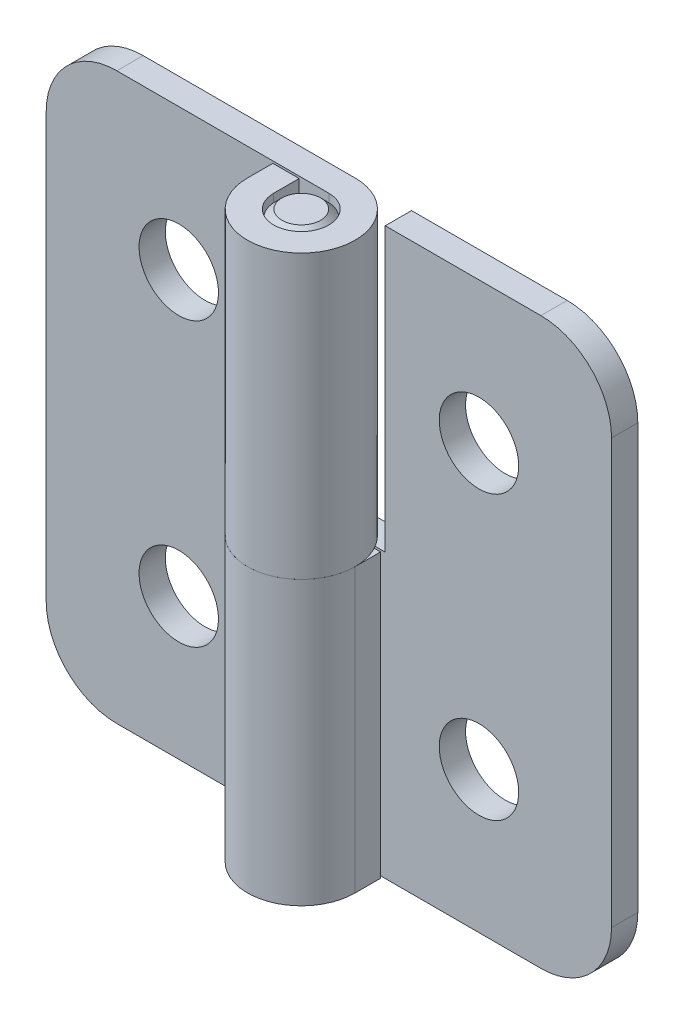
ISO-10303-21;
HEADER;
FILE_DESCRIPTION(('STEP AP214'),'2;1');
FILE_NAME('part.step','',(''),(''),'','','');
FILE_SCHEMA(('AUTOMOTIVE_DESIGN { 1 0 10303 214 1 1 1 1 }'));
ENDSEC;
DATA;
#1=APPLICATION_CONTEXT('core data for automotive mechanical design processes');
#2=APPLICATION_PROTOCOL_DEFINITION('international standard','automotive_design',2000,#1);
#3=PRODUCT_CONTEXT('',#1,'mechanical');
#4=PRODUCT('Part','Part','',(#3));
#5=PRODUCT_RELATED_PRODUCT_CATEGORY('part','',(#4));
#6=PRODUCT_DEFINITION_FORMATION('','',#4);
#7=PRODUCT_DEFINITION_CONTEXT('part definition',#1,'design');
#8=PRODUCT_DEFINITION('design','',#6,#7);
#9=PRODUCT_DEFINITION_SHAPE('','',#8);
#10=(LENGTH_UNIT() NAMED_UNIT(*) SI_UNIT(.MILLI.,.METRE.));
#11=(NAMED_UNIT(*) PLANE_ANGLE_UNIT() SI_UNIT($,.RADIAN.));
#12=(NAMED_UNIT(*) SI_UNIT($,.STERADIAN.) SOLID_ANGLE_UNIT());
#13=UNCERTAINTY_MEASURE_WITH_UNIT(LENGTH_MEASURE(1.E-05),#10,'distance_accuracy_value','');
#14=(GEOMETRIC_REPRESENTATION_CONTEXT(3) GLOBAL_UNCERTAINTY_ASSIGNED_CONTEXT((#13)) GLOBAL_UNIT_ASSIGNED_CONTEXT((#10,
#11,#12)) REPRESENTATION_CONTEXT('',''));
#15=CARTESIAN_POINT('',(0.,0.,0.));
#16=DIRECTION('',(0.,0.,1.));
#17=DIRECTION('',(1.,0.,0.));
#18=AXIS2_PLACEMENT_3D('',#15,#16,#17);
#19=CARTESIAN_POINT('',(4.8387,-25.4,2.55270000000001));
#20=DIRECTION('',(1.,0.,0.));
#21=DIRECTION('',(0.,0.,1.));
#22=AXIS2_PLACEMENT_3D('',#19,#20,#21);
#23=PLANE('',#22);
#24=DIRECTION('',(0.,0.,1.));
#25=VECTOR('',#24,1.);
#26=CARTESIAN_POINT('',(4.8387,0.,10.9397930174127));
#27=LINE('',#26,#25);
#28=CARTESIAN_POINT('',(4.8387,0.,2.55270000000001));
#29=VERTEX_POINT('',#28);
#30=CARTESIAN_POINT('',(4.8387,0.,4.8387));
#31=VERTEX_POINT('',#30);
#32=EDGE_CURVE('P0_E274',#29,#31,#27,.T.);
#33=ORIENTED_EDGE('',*,*,#32,.T.);
#34=DIRECTION('',(0.,1.,0.));
#35=VECTOR('',#34,1.);
#36=CARTESIAN_POINT('',(4.8387,-25.4,4.8387));
#37=LINE('',#36,#35);
#38=CARTESIAN_POINT('',(4.83870000000001,-25.4,4.8387));
#39=VERTEX_POINT('',#38);
#40=EDGE_CURVE('P0_E250',#39,#31,#37,.T.);
#41=ORIENTED_EDGE('',*,*,#40,.F.);
#42=DIRECTION('',(0.,0.,-1.));
#43=VECTOR('',#42,1.);
#44=CARTESIAN_POINT('',(4.83870000000002,-25.4,3.43572275257362));
#45=LINE('',#44,#43);
#46=CARTESIAN_POINT('',(4.83870000000001,-25.4,2.55270000000001));
#47=VERTEX_POINT('',#46);
#48=EDGE_CURVE('P0_E220',#47,#39,#45,.F.);
#49=ORIENTED_EDGE('',*,*,#48,.F.);
#50=DIRECTION('',(0.,1.,0.));
#51=VECTOR('',#50,1.);
#52=CARTESIAN_POINT('',(4.8387,-25.4,2.55270000000001));
#53=LINE('',#52,#51);
#54=EDGE_CURVE('P0_E257',#29,#47,#53,.F.);
#55=ORIENTED_EDGE('',*,*,#54,.F.);
#56=EDGE_LOOP('',(#33,#41,#49,#55));
#57=FACE_BOUND('',#56,.T.);
#58=ADVANCED_FACE('P0_F46',(#57),#23,.T.);
#59=CARTESIAN_POINT('',(0.,-25.4,4.8387));
#60=DIRECTION('',(0.,1.,0.));
#61=DIRECTION('',(-1.,0.,0.));
#62=AXIS2_PLACEMENT_3D('',#59,#60,#61);
#63=CYLINDRICAL_SURFACE('',#62,4.8387);
#64=CARTESIAN_POINT('',(0.,0.,4.8387));
#65=DIRECTION('',(0.,1.,0.));
#66=DIRECTION('',(-1.,0.,0.));
#67=AXIS2_PLACEMENT_3D('',#64,#65,#66);
#68=CIRCLE('',#67,4.8387);
#69=CARTESIAN_POINT('',(0.,0.,0.));
#70=VERTEX_POINT('',#69);
#71=EDGE_CURVE('P0_E282',#31,#70,#68,.F.);
#72=ORIENTED_EDGE('',*,*,#71,.T.);
#73=DIRECTION('',(0.,1.,0.));
#74=VECTOR('',#73,1.);
#75=CARTESIAN_POINT('',(0.,-25.4,0.));
#76=LINE('',#75,#74);
#77=CARTESIAN_POINT('',(0.,-25.4,0.));
#78=VERTEX_POINT('',#77);
#79=EDGE_CURVE('P0_E260',#78,#70,#76,.T.);
#80=ORIENTED_EDGE('',*,*,#79,.F.);
#81=CARTESIAN_POINT('',(0.,-25.4,4.8387));
#82=DIRECTION('',(0.,1.,0.));
#83=DIRECTION('',(-1.,0.,0.));
#84=AXIS2_PLACEMENT_3D('',#81,#82,#83);
#85=CIRCLE('',#84,4.8387);
#86=EDGE_CURVE('P0_E214',#39,#78,#85,.F.);
#87=ORIENTED_EDGE('',*,*,#86,.F.);
#88=ORIENTED_EDGE('',*,*,#40,.T.);
#89=EDGE_LOOP('',(#72,#80,#87,#88));
#90=FACE_BOUND('',#89,.T.);
#91=ADVANCED_FACE('P0_F354',(#90),#63,.T.);
#92=CARTESIAN_POINT('',(2.4765,-25.4,4.8387));
#93=DIRECTION('',(-1.,0.,0.));
#94=DIRECTION('',(0.,-1.,0.));
#95=AXIS2_PLACEMENT_3D('',#92,#93,#94);
#96=PLANE('',#95);
#97=DIRECTION('',(0.,0.,1.));
#98=VECTOR('',#97,1.);
#99=CARTESIAN_POINT('',(2.47650000000001,0.,10.9397930174127));
#100=LINE('',#99,#98);
#101=CARTESIAN_POINT('',(2.47650000000001,0.,4.8387));
#102=VERTEX_POINT('',#101);
#103=CARTESIAN_POINT('',(2.47650000000002,0.,2.55270000000001));
#104=VERTEX_POINT('',#103);
#105=EDGE_CURVE('P0_E171',#102,#104,#100,.F.);
#106=ORIENTED_EDGE('',*,*,#105,.T.);
#107=DIRECTION('',(0.,1.,0.));
#108=VECTOR('',#107,1.);
#109=CARTESIAN_POINT('',(2.47650000000004,-25.4,2.55270000000001));
#110=LINE('',#109,#108);
#111=CARTESIAN_POINT('',(2.47650000000002,-25.4,2.55270000000001));
#112=VERTEX_POINT('',#111);
#113=EDGE_CURVE('P0_E249',#112,#104,#110,.T.);
#114=ORIENTED_EDGE('',*,*,#113,.F.);
#115=DIRECTION('',(0.,0.,-1.));
#116=VECTOR('',#115,1.);
#117=CARTESIAN_POINT('',(2.47650000000001,-25.4,3.43572275257362));
#118=LINE('',#117,#116);
#119=CARTESIAN_POINT('',(2.47650000000001,-25.4,4.8387));
#120=VERTEX_POINT('',#119);
#121=EDGE_CURVE('P0_E218',#120,#112,#118,.T.);
#122=ORIENTED_EDGE('',*,*,#121,.F.);
#123=DIRECTION('',(0.,-1.,0.));
#124=VECTOR('',#123,1.);
#125=CARTESIAN_POINT('',(2.4765,-25.4,4.8387));
#126=LINE('',#125,#124);
#127=EDGE_CURVE('P0_E246',#120,#102,#126,.F.);
#128=ORIENTED_EDGE('',*,*,#127,.T.);
#129=EDGE_LOOP('',(#106,#114,#122,#128));
#130=FACE_BOUND('',#129,.T.);
#131=ADVANCED_FACE('P0_F344',(#130),#96,.T.);
#132=CARTESIAN_POINT('',(2.47650000000005,-25.4,2.55270000000001));
#133=DIRECTION('',(0.,0.,-1.));
#134=DIRECTION('',(0.,1.,0.));
#135=AXIS2_PLACEMENT_3D('',#132,#133,#134);
#136=PLANE('',#135);
#137=DIRECTION('',(1.,0.,0.));
#138=VECTOR('',#137,1.);
#139=CARTESIAN_POINT('',(-4.8387,0.,2.55270000000001));
#140=LINE('',#139,#138);
#141=EDGE_CURVE('P0_E271',#104,#29,#140,.T.);
#142=ORIENTED_EDGE('',*,*,#141,.T.);
#143=ORIENTED_EDGE('',*,*,#54,.T.);
#144=DIRECTION('',(1.,0.,0.));
#145=VECTOR('',#144,1.);
#146=CARTESIAN_POINT('',(6.02577724742644,-25.4,2.55270000000001));
#147=LINE('',#146,#145);
#148=EDGE_CURVE('P0_E242',#112,#47,#147,.T.);
#149=ORIENTED_EDGE('',*,*,#148,.F.);
#150=ORIENTED_EDGE('',*,*,#113,.T.);
#151=EDGE_LOOP('',(#142,#143,#149,#150));
#152=FACE_BOUND('',#151,.T.);
#153=ADVANCED_FACE('P0_F303',(#152),#136,.T.);
#154=CARTESIAN_POINT('',(0.,-25.4,0.));
#155=DIRECTION('',(0.,0.,-1.));
#156=DIRECTION('',(0.,1.,0.));
#157=AXIS2_PLACEMENT_3D('',#154,#155,#156);
#158=PLANE('',#157);
#159=DIRECTION('',(0.,-1.,0.));
#160=VECTOR('',#159,1.);
#161=CARTESIAN_POINT('',(25.4,-25.4,0.));
#162=LINE('',#161,#160);
#163=CARTESIAN_POINT('',(25.4,-19.05,0.));
#164=VERTEX_POINT('',#163);
#165=CARTESIAN_POINT('',(25.4,19.05,0.));
#166=VERTEX_POINT('',#165);
#167=EDGE_CURVE('P0_E211',#164,#166,#162,.F.);
#168=ORIENTED_EDGE('',*,*,#167,.F.);
#169=CARTESIAN_POINT('',(19.05,-19.05,0.));
#170=DIRECTION('',(0.,0.,-1.));
#171=DIRECTION('',(-1.,0.,0.));
#172=AXIS2_PLACEMENT_3D('',#169,#170,#171);
#173=CIRCLE('',#172,6.35);
#174=CARTESIAN_POINT('',(19.05,-25.4,0.));
#175=VERTEX_POINT('',#174);
#176=EDGE_CURVE('P0_E198',#164,#175,#173,.T.);
#177=ORIENTED_EDGE('',*,*,#176,.T.);
#178=DIRECTION('',(1.,0.,0.));
#179=VECTOR('',#178,1.);
#180=CARTESIAN_POINT('',(6.02577724742644,-25.4,0.));
#181=LINE('',#180,#179);
#182=EDGE_CURVE('P0_E209',#78,#175,#181,.T.);
#183=ORIENTED_EDGE('',*,*,#182,.F.);
#184=ORIENTED_EDGE('',*,*,#79,.T.);
#185=DIRECTION('',(1.,0.,0.));
#186=VECTOR('',#185,1.);
#187=CARTESIAN_POINT('',(-4.8387,0.,0.));
#188=LINE('',#187,#186);
#189=CARTESIAN_POINT('',(5.0673,0.,0.));
#190=VERTEX_POINT('',#189);
#191=EDGE_CURVE('P0_E147',#70,#190,#188,.T.);
#192=ORIENTED_EDGE('',*,*,#191,.T.);
#193=DIRECTION('',(0.,1.,0.));
#194=VECTOR('',#193,1.);
#195=CARTESIAN_POINT('',(5.0673,25.4,0.));
#196=LINE('',#195,#194);
#197=CARTESIAN_POINT('',(5.0673,25.4,0.));
#198=VERTEX_POINT('',#197);
#199=EDGE_CURVE('P0_E143',#190,#198,#196,.T.);
#200=ORIENTED_EDGE('',*,*,#199,.T.);
#201=DIRECTION('',(1.,0.,0.));
#202=VECTOR('',#201,1.);
#203=CARTESIAN_POINT('',(25.4,25.4,0.));
#204=LINE('',#203,#202);
#205=CARTESIAN_POINT('',(19.05,25.4,0.));
#206=VERTEX_POINT('',#205);
#207=EDGE_CURVE('P0_E176',#198,#206,#204,.T.);
#208=ORIENTED_EDGE('',*,*,#207,.T.);
#209=CARTESIAN_POINT('',(19.05,19.05,0.));
#210=DIRECTION('',(0.,0.,-1.));
#211=DIRECTION('',(-1.,0.,0.));
#212=AXIS2_PLACEMENT_3D('',#209,#210,#211);
#213=CIRCLE('',#212,6.35);
#214=EDGE_CURVE('P0_E199',#206,#166,#213,.T.);
#215=ORIENTED_EDGE('',*,*,#214,.T.);
#216=EDGE_LOOP('',(#168,#177,#183,#184,#192,#200,#208,#215));
#217=FACE_BOUND('',#216,.T.);
#218=CARTESIAN_POINT('',(13.4874,12.7,0.));
#219=DIRECTION('',(0.,0.,1.));
#220=DIRECTION('',(0.,-1.,0.));
#221=AXIS2_PLACEMENT_3D('',#218,#219,#220);
#222=CIRCLE('',#221,3.5687);
#223=CARTESIAN_POINT('',(13.4874,9.13129999999999,0.));
#224=VERTEX_POINT('',#223);
#225=EDGE_CURVE('P0_E283',#224,#224,#222,.T.);
#226=ORIENTED_EDGE('',*,*,#225,.T.);
#227=EDGE_LOOP('',(#226));
#228=FACE_BOUND('',#227,.T.);
#229=CARTESIAN_POINT('',(13.4874,-12.7,0.));
#230=DIRECTION('',(0.,0.,1.));
#231=DIRECTION('',(0.,-1.,0.));
#232=AXIS2_PLACEMENT_3D('',#229,#230,#231);
#233=CIRCLE('',#232,3.5687);
#234=CARTESIAN_POINT('',(13.4874,-16.2687,0.));
#235=VERTEX_POINT('',#234);
#236=EDGE_CURVE('P0_E238',#235,#235,#233,.T.);
#237=ORIENTED_EDGE('',*,*,#236,.T.);
#238=EDGE_LOOP('',(#237));
#239=FACE_BOUND('',#238,.T.);
#240=ADVANCED_FACE('P0_F206',(#217,#228,#239),#158,.T.);
#241=CARTESIAN_POINT('',(13.4874,-12.7,-3.9066238945256));
#242=DIRECTION('',(0.,0.,1.));
#243=DIRECTION('',(0.,-1.,0.));
#244=AXIS2_PLACEMENT_3D('',#241,#242,#243);
#245=CYLINDRICAL_SURFACE('',#244,3.5687);
#246=CARTESIAN_POINT('',(13.4874,-12.7,2.3622));
#247=DIRECTION('',(0.,0.,1.));
#248=DIRECTION('',(0.,-1.,0.));
#249=AXIS2_PLACEMENT_3D('',#246,#247,#248);
#250=CIRCLE('',#249,3.5687);
#251=CARTESIAN_POINT('',(13.4874,-16.2687,2.3622));
#252=VERTEX_POINT('',#251);
#253=EDGE_CURVE('P0_E241',#252,#252,#250,.F.);
#254=ORIENTED_EDGE('',*,*,#253,.F.);
#255=EDGE_LOOP('',(#254));
#256=FACE_BOUND('',#255,.T.);
#257=ORIENTED_EDGE('',*,*,#236,.F.);
#258=EDGE_LOOP('',(#257));
#259=FACE_BOUND('',#258,.T.);
#260=ADVANCED_FACE('P0_F291',(#256,#259),#245,.F.);
#261=CARTESIAN_POINT('',(13.4874,12.7,-3.9066238945256));
#262=DIRECTION('',(0.,0.,1.));
#263=DIRECTION('',(0.,-1.,0.));
#264=AXIS2_PLACEMENT_3D('',#261,#262,#263);
#265=CYLINDRICAL_SURFACE('',#264,3.5687);
#266=CARTESIAN_POINT('',(13.4874,12.7,2.3622));
#267=DIRECTION('',(0.,0.,1.));
#268=DIRECTION('',(0.,-1.,0.));
#269=AXIS2_PLACEMENT_3D('',#266,#267,#268);
#270=CIRCLE('',#269,3.5687);
#271=CARTESIAN_POINT('',(13.4874,9.13129999999999,2.3622));
#272=VERTEX_POINT('',#271);
#273=EDGE_CURVE('P0_E162',#272,#272,#270,.F.);
#274=ORIENTED_EDGE('',*,*,#273,.F.);
#275=EDGE_LOOP('',(#274));
#276=FACE_BOUND('',#275,.T.);
#277=ORIENTED_EDGE('',*,*,#225,.F.);
#278=EDGE_LOOP('',(#277));
#279=FACE_BOUND('',#278,.T.);
#280=ADVANCED_FACE('P0_F293',(#276,#279),#265,.F.);
#281=CARTESIAN_POINT('',(25.4,25.4,2.3622));
#282=DIRECTION('',(0.,-1.,0.));
#283=DIRECTION('',(0.,0.,-1.));
#284=AXIS2_PLACEMENT_3D('',#281,#282,#283);
#285=PLANE('',#284);
#286=DIRECTION('',(1.,0.,0.));
#287=VECTOR('',#286,1.);
#288=CARTESIAN_POINT('',(25.4,25.4,2.3622));
#289=LINE('',#288,#287);
#290=CARTESIAN_POINT('',(19.05,25.4,2.3622));
#291=VERTEX_POINT('',#290);
#292=CARTESIAN_POINT('',(5.0673,25.4,2.3622));
#293=VERTEX_POINT('',#292);
#294=EDGE_CURVE('P0_E159',#291,#293,#289,.F.);
#295=ORIENTED_EDGE('',*,*,#294,.F.);
#296=DIRECTION('',(0.,0.,1.));
#297=VECTOR('',#296,1.);
#298=CARTESIAN_POINT('',(19.05,25.4,0.));
#299=LINE('',#298,#297);
#300=EDGE_CURVE('P0_E12',#291,#206,#299,.F.);
#301=ORIENTED_EDGE('',*,*,#300,.T.);
#302=ORIENTED_EDGE('',*,*,#207,.F.);
#303=DIRECTION('',(0.,0.,1.));
#304=VECTOR('',#303,1.);
#305=CARTESIAN_POINT('',(5.0673,25.4,10.9397930174127));
#306=LINE('',#305,#304);
#307=EDGE_CURVE('P0_E169',#198,#293,#306,.T.);
#308=ORIENTED_EDGE('',*,*,#307,.T.);
#309=EDGE_LOOP('',(#295,#301,#302,#308));
#310=FACE_BOUND('',#309,.T.);
#311=ADVANCED_FACE('P0_F300',(#310),#285,.F.);
#312=CARTESIAN_POINT('',(5.0673,25.4,10.9397930174127));
#313=DIRECTION('',(1.,0.,0.));
#314=DIRECTION('',(0.,1.,0.));
#315=AXIS2_PLACEMENT_3D('',#312,#313,#314);
#316=PLANE('',#315);
#317=ORIENTED_EDGE('',*,*,#199,.F.);
#318=DIRECTION('',(0.,0.,1.));
#319=VECTOR('',#318,1.);
#320=CARTESIAN_POINT('',(5.0673,0.,10.9397930174127));
#321=LINE('',#320,#319);
#322=CARTESIAN_POINT('',(5.0673,0.,2.3622));
#323=VERTEX_POINT('',#322);
#324=EDGE_CURVE('P0_E137',#190,#323,#321,.T.);
#325=ORIENTED_EDGE('',*,*,#324,.T.);
#326=DIRECTION('',(0.,-1.,0.));
#327=VECTOR('',#326,1.);
#328=CARTESIAN_POINT('',(5.0673,-25.4,2.3622));
#329=LINE('',#328,#327);
#330=EDGE_CURVE('P0_E142',#293,#323,#329,.T.);
#331=ORIENTED_EDGE('',*,*,#330,.F.);
#332=ORIENTED_EDGE('',*,*,#307,.F.);
#333=EDGE_LOOP('',(#317,#325,#331,#332));
#334=FACE_BOUND('',#333,.T.);
#335=ADVANCED_FACE('P0_F139',(#334),#316,.F.);
#336=CARTESIAN_POINT('',(-4.8387,0.,10.9397930174127));
#337=DIRECTION('',(0.,-1.,0.));
#338=DIRECTION('',(1.,0.,0.));
#339=AXIS2_PLACEMENT_3D('',#336,#337,#338);
#340=PLANE('',#339);
#341=ORIENTED_EDGE('',*,*,#191,.F.);
#342=ORIENTED_EDGE('',*,*,#71,.F.);
#343=ORIENTED_EDGE('',*,*,#32,.F.);
#344=ORIENTED_EDGE('',*,*,#141,.F.);
#345=ORIENTED_EDGE('',*,*,#105,.F.);
#346=CARTESIAN_POINT('',(0.,0.,4.8387));
#347=DIRECTION('',(0.,1.,0.));
#348=DIRECTION('',(-1.,0.,0.));
#349=AXIS2_PLACEMENT_3D('',#346,#347,#348);
#350=CIRCLE('',#349,2.4765);
#351=CARTESIAN_POINT('',(0.,0.,2.3622));
#352=VERTEX_POINT('',#351);
#353=EDGE_CURVE('P0_E146',#102,#352,#350,.F.);
#354=ORIENTED_EDGE('',*,*,#353,.T.);
#355=DIRECTION('',(1.,0.,0.));
#356=VECTOR('',#355,1.);
#357=CARTESIAN_POINT('',(25.4,0.,2.3622));
#358=LINE('',#357,#356);
#359=EDGE_CURVE('P0_E150',#323,#352,#358,.F.);
#360=ORIENTED_EDGE('',*,*,#359,.F.);
#361=ORIENTED_EDGE('',*,*,#324,.F.);
#362=EDGE_LOOP('',(#341,#342,#343,#344,#345,#354,#360,#361));
#363=FACE_BOUND('',#362,.T.);
#364=ADVANCED_FACE('P0_F151',(#363),#340,.F.);
#365=CARTESIAN_POINT('',(0.,-25.4,4.8387));
#366=DIRECTION('',(0.,1.,0.));
#367=DIRECTION('',(-1.,0.,0.));
#368=AXIS2_PLACEMENT_3D('',#365,#366,#367);
#369=CYLINDRICAL_SURFACE('',#368,2.4765);
#370=CARTESIAN_POINT('',(0.,-25.4,4.8387));
#371=DIRECTION('',(0.,1.,0.));
#372=DIRECTION('',(-1.,0.,0.));
#373=AXIS2_PLACEMENT_3D('',#370,#371,#372);
#374=CIRCLE('',#373,2.4765);
#375=CARTESIAN_POINT('',(0.,-25.4,2.3622));
#376=VERTEX_POINT('',#375);
#377=EDGE_CURVE('P0_E215',#376,#120,#374,.T.);
#378=ORIENTED_EDGE('',*,*,#377,.F.);
#379=DIRECTION('',(0.,-1.,0.));
#380=VECTOR('',#379,1.);
#381=CARTESIAN_POINT('',(0.,-25.4,2.3622));
#382=LINE('',#381,#380);
#383=EDGE_CURVE('P0_E155',#352,#376,#382,.T.);
#384=ORIENTED_EDGE('',*,*,#383,.F.);
#385=ORIENTED_EDGE('',*,*,#353,.F.);
#386=ORIENTED_EDGE('',*,*,#127,.F.);
#387=EDGE_LOOP('',(#378,#384,#385,#386));
#388=FACE_BOUND('',#387,.T.);
#389=ADVANCED_FACE('P0_F316',(#388),#369,.F.);
#390=CARTESIAN_POINT('',(6.02577724742644,-25.4,3.43572275257362));
#391=DIRECTION('',(0.,-1.,0.));
#392=DIRECTION('',(0.,0.,-1.));
#393=AXIS2_PLACEMENT_3D('',#390,#391,#392);
#394=PLANE('',#393);
#395=ORIENTED_EDGE('',*,*,#182,.T.);
#396=DIRECTION('',(0.,0.,-1.));
#397=VECTOR('',#396,1.);
#398=CARTESIAN_POINT('',(19.05,-25.4,3.43572275257362));
#399=LINE('',#398,#397);
#400=CARTESIAN_POINT('',(19.05,-25.4,2.3622));
#401=VERTEX_POINT('',#400);
#402=EDGE_CURVE('P0_E69',#175,#401,#399,.F.);
#403=ORIENTED_EDGE('',*,*,#402,.T.);
#404=DIRECTION('',(1.,0.,0.));
#405=VECTOR('',#404,1.);
#406=CARTESIAN_POINT('',(25.4,-25.4,2.3622));
#407=LINE('',#406,#405);
#408=EDGE_CURVE('P0_E184',#376,#401,#407,.T.);
#409=ORIENTED_EDGE('',*,*,#408,.F.);
#410=ORIENTED_EDGE('',*,*,#377,.T.);
#411=ORIENTED_EDGE('',*,*,#121,.T.);
#412=ORIENTED_EDGE('',*,*,#148,.T.);
#413=ORIENTED_EDGE('',*,*,#48,.T.);
#414=ORIENTED_EDGE('',*,*,#86,.T.);
#415=EDGE_LOOP('',(#395,#403,#409,#410,#411,#412,#413,#414));
#416=FACE_BOUND('',#415,.T.);
#417=ADVANCED_FACE('P0_F212',(#416),#394,.T.);
#418=CARTESIAN_POINT('',(25.4,-25.4,0.));
#419=DIRECTION('',(1.,0.,0.));
#420=DIRECTION('',(0.,0.,1.));
#421=AXIS2_PLACEMENT_3D('',#418,#419,#420);
#422=PLANE('',#421);
#423=DIRECTION('',(0.,-1.,0.));
#424=VECTOR('',#423,1.);
#425=CARTESIAN_POINT('',(25.4,-25.4,2.3622));
#426=LINE('',#425,#424);
#427=CARTESIAN_POINT('',(25.4,-19.05,2.3622));
#428=VERTEX_POINT('',#427);
#429=CARTESIAN_POINT('',(25.4,19.05,2.3622));
#430=VERTEX_POINT('',#429);
#431=EDGE_CURVE('P0_E183',#428,#430,#426,.F.);
#432=ORIENTED_EDGE('',*,*,#431,.F.);
#433=DIRECTION('',(0.,0.,-1.));
#434=VECTOR('',#433,1.);
#435=CARTESIAN_POINT('',(25.4,-19.05,0.));
#436=LINE('',#435,#434);
#437=EDGE_CURVE('P0_E192',#428,#164,#436,.T.);
#438=ORIENTED_EDGE('',*,*,#437,.T.);
#439=ORIENTED_EDGE('',*,*,#167,.T.);
#440=DIRECTION('',(0.,0.,1.));
#441=VECTOR('',#440,1.);
#442=CARTESIAN_POINT('',(25.4,19.05,2.3622));
#443=LINE('',#442,#441);
#444=EDGE_CURVE('P0_E195',#166,#430,#443,.T.);
#445=ORIENTED_EDGE('',*,*,#444,.T.);
#446=EDGE_LOOP('',(#432,#438,#439,#445));
#447=FACE_BOUND('',#446,.T.);
#448=ADVANCED_FACE('P0_F190',(#447),#422,.T.);
#449=CARTESIAN_POINT('',(25.4,-25.4,2.3622));
#450=DIRECTION('',(0.,0.,1.));
#451=DIRECTION('',(0.,-1.,0.));
#452=AXIS2_PLACEMENT_3D('',#449,#450,#451);
#453=PLANE('',#452);
#454=ORIENTED_EDGE('',*,*,#408,.T.);
#455=CARTESIAN_POINT('',(19.05,-19.05,2.3622));
#456=DIRECTION('',(0.,0.,1.));
#457=DIRECTION('',(1.,0.,0.));
#458=AXIS2_PLACEMENT_3D('',#455,#456,#457);
#459=CIRCLE('',#458,6.35);
#460=EDGE_CURVE('P0_E54',#401,#428,#459,.T.);
#461=ORIENTED_EDGE('',*,*,#460,.T.);
#462=ORIENTED_EDGE('',*,*,#431,.T.);
#463=CARTESIAN_POINT('',(19.05,19.05,2.3622));
#464=DIRECTION('',(0.,0.,1.));
#465=DIRECTION('',(1.,0.,0.));
#466=AXIS2_PLACEMENT_3D('',#463,#464,#465);
#467=CIRCLE('',#466,6.35);
#468=EDGE_CURVE('P0_E61',#430,#291,#467,.T.);
#469=ORIENTED_EDGE('',*,*,#468,.T.);
#470=ORIENTED_EDGE('',*,*,#294,.T.);
#471=ORIENTED_EDGE('',*,*,#330,.T.);
#472=ORIENTED_EDGE('',*,*,#359,.T.);
#473=ORIENTED_EDGE('',*,*,#383,.T.);
#474=EDGE_LOOP('',(#454,#461,#462,#469,#470,#471,#472,#473));
#475=FACE_BOUND('',#474,.T.);
#476=ORIENTED_EDGE('',*,*,#273,.T.);
#477=EDGE_LOOP('',(#476));
#478=FACE_BOUND('',#477,.T.);
#479=ORIENTED_EDGE('',*,*,#253,.T.);
#480=EDGE_LOOP('',(#479));
#481=FACE_BOUND('',#480,.T.);
#482=ADVANCED_FACE('P0_F157',(#475,#478,#481),#453,.T.);
#483=CARTESIAN_POINT('',(19.05,-19.05,0.));
#484=DIRECTION('',(0.,0.,-1.));
#485=DIRECTION('',(-1.,0.,0.));
#486=AXIS2_PLACEMENT_3D('',#483,#484,#485);
#487=CYLINDRICAL_SURFACE('',#486,6.35);
#488=ORIENTED_EDGE('',*,*,#460,.F.);
#489=ORIENTED_EDGE('',*,*,#402,.F.);
#490=ORIENTED_EDGE('',*,*,#176,.F.);
#491=ORIENTED_EDGE('',*,*,#437,.F.);
#492=EDGE_LOOP('',(#488,#489,#490,#491));
#493=FACE_BOUND('',#492,.T.);
#494=ADVANCED_FACE('P0_F197',(#493),#487,.T.);
#495=CARTESIAN_POINT('',(19.05,19.05,0.));
#496=DIRECTION('',(0.,0.,-1.));
#497=DIRECTION('',(-1.,0.,0.));
#498=AXIS2_PLACEMENT_3D('',#495,#496,#497);
#499=CYLINDRICAL_SURFACE('',#498,6.35);
#500=ORIENTED_EDGE('',*,*,#214,.F.);
#501=ORIENTED_EDGE('',*,*,#300,.F.);
#502=ORIENTED_EDGE('',*,*,#468,.F.);
#503=ORIENTED_EDGE('',*,*,#444,.F.);
#504=EDGE_LOOP('',(#500,#501,#502,#503));
#505=FACE_BOUND('',#504,.T.);
#506=ADVANCED_FACE('P0_F48',(#505),#499,.T.);
#507=CLOSED_SHELL('',(#58,#91,#131,#153,#240,#260,#280,#311,#335,#364,#389,#417,#448,#482,#494,#506));
#508=MANIFOLD_SOLID_BREP('P0_B2',#507);
#509=CARTESIAN_POINT('',(-4.8387,25.4,2.55270000000001));
#510=DIRECTION('',(-1.,0.,0.));
#511=DIRECTION('',(0.,0.,1.));
#512=AXIS2_PLACEMENT_3D('',#509,#510,#511);
#513=PLANE('',#512);
#514=DIRECTION('',(0.,0.,1.));
#515=VECTOR('',#514,1.);
#516=CARTESIAN_POINT('',(-4.83870000000001,0.,10.9397930174127));
#517=LINE('',#516,#515);
#518=CARTESIAN_POINT('',(-4.83870000000001,0.,2.55270000000001));
#519=VERTEX_POINT('',#518);
#520=CARTESIAN_POINT('',(-4.83870000000001,0.,4.8387));
#521=VERTEX_POINT('',#520);
#522=EDGE_CURVE('P0_E899',#519,#521,#517,.T.);
#523=ORIENTED_EDGE('',*,*,#522,.T.);
#524=DIRECTION('',(0.,-1.,0.));
#525=VECTOR('',#524,1.);
#526=CARTESIAN_POINT('',(-4.8387,25.4,4.8387));
#527=LINE('',#526,#525);
#528=CARTESIAN_POINT('',(-4.83870000000001,25.4,4.8387));
#529=VERTEX_POINT('',#528);
#530=EDGE_CURVE('P0_E872',#529,#521,#527,.T.);
#531=ORIENTED_EDGE('',*,*,#530,.F.);
#532=DIRECTION('',(0.,0.,-1.));
#533=VECTOR('',#532,1.);
#534=CARTESIAN_POINT('',(-4.83870000000002,25.4,3.43572275257362));
#535=LINE('',#534,#533);
#536=CARTESIAN_POINT('',(-4.83870000000002,25.4,2.55270000000001));
#537=VERTEX_POINT('',#536);
#538=EDGE_CURVE('P0_E913',#537,#529,#535,.F.);
#539=ORIENTED_EDGE('',*,*,#538,.F.);
#540=DIRECTION('',(0.,-1.,0.));
#541=VECTOR('',#540,1.);
#542=CARTESIAN_POINT('',(-4.83870000000001,25.4,2.55270000000001));
#543=LINE('',#542,#541);
#544=EDGE_CURVE('P0_E880',#519,#537,#543,.F.);
#545=ORIENTED_EDGE('',*,*,#544,.F.);
#546=EDGE_LOOP('',(#523,#531,#539,#545));
#547=FACE_BOUND('',#546,.T.);
#548=ADVANCED_FACE('P0_F697',(#547),#513,.T.);
#549=CARTESIAN_POINT('',(0.,25.4,4.8387));
#550=DIRECTION('',(0.,-1.,0.));
#551=DIRECTION('',(1.,0.,0.));
#552=AXIS2_PLACEMENT_3D('',#549,#550,#551);
#553=CYLINDRICAL_SURFACE('',#552,4.8387);
#554=CARTESIAN_POINT('',(0.,0.,4.8387));
#555=DIRECTION('',(0.,-1.,0.));
#556=DIRECTION('',(1.,0.,0.));
#557=AXIS2_PLACEMENT_3D('',#554,#555,#556);
#558=CIRCLE('',#557,4.8387);
#559=CARTESIAN_POINT('',(0.,0.,0.));
#560=VERTEX_POINT('',#559);
#561=EDGE_CURVE('P0_E915',#521,#560,#558,.F.);
#562=ORIENTED_EDGE('',*,*,#561,.T.);
#563=DIRECTION('',(0.,-1.,0.));
#564=VECTOR('',#563,1.);
#565=CARTESIAN_POINT('',(0.,25.4,0.));
#566=LINE('',#565,#564);
#567=CARTESIAN_POINT('',(0.,25.4,0.));
#568=VERTEX_POINT('',#567);
#569=EDGE_CURVE('P0_E883',#568,#560,#566,.T.);
#570=ORIENTED_EDGE('',*,*,#569,.F.);
#571=CARTESIAN_POINT('',(0.,25.4,4.8387));
#572=DIRECTION('',(0.,-1.,0.));
#573=DIRECTION('',(1.,0.,0.));
#574=AXIS2_PLACEMENT_3D('',#571,#572,#573);
#575=CIRCLE('',#574,4.8387);
#576=EDGE_CURVE('P0_E910',#529,#568,#575,.F.);
#577=ORIENTED_EDGE('',*,*,#576,.F.);
#578=ORIENTED_EDGE('',*,*,#530,.T.);
#579=EDGE_LOOP('',(#562,#570,#577,#578));
#580=FACE_BOUND('',#579,.T.);
#581=ADVANCED_FACE('P0_F1045',(#580),#553,.T.);
#582=CARTESIAN_POINT('',(-2.47650000000001,25.4,4.8387));
#583=DIRECTION('',(1.,0.,0.));
#584=DIRECTION('',(0.,1.,0.));
#585=AXIS2_PLACEMENT_3D('',#582,#583,#584);
#586=PLANE('',#585);
#587=DIRECTION('',(0.,0.,1.));
#588=VECTOR('',#587,1.);
#589=CARTESIAN_POINT('',(-2.47650000000001,0.,10.9397930174127));
#590=LINE('',#589,#588);
#591=CARTESIAN_POINT('',(-2.47650000000001,0.,4.8387));
#592=VERTEX_POINT('',#591);
#593=CARTESIAN_POINT('',(-2.47650000000002,0.,2.55270000000001));
#594=VERTEX_POINT('',#593);
#595=EDGE_CURVE('P0_E825',#592,#594,#590,.F.);
#596=ORIENTED_EDGE('',*,*,#595,.T.);
#597=DIRECTION('',(0.,-1.,0.));
#598=VECTOR('',#597,1.);
#599=CARTESIAN_POINT('',(-2.47650000000004,25.4,2.55270000000001));
#600=LINE('',#599,#598);
#601=CARTESIAN_POINT('',(-2.47650000000003,25.4,2.55270000000001));
#602=VERTEX_POINT('',#601);
#603=EDGE_CURVE('P0_E871',#602,#594,#600,.T.);
#604=ORIENTED_EDGE('',*,*,#603,.F.);
#605=DIRECTION('',(0.,0.,-1.));
#606=VECTOR('',#605,1.);
#607=CARTESIAN_POINT('',(-2.47650000000002,25.4,3.43572275257362));
#608=LINE('',#607,#606);
#609=CARTESIAN_POINT('',(-2.47650000000001,25.4,4.8387));
#610=VERTEX_POINT('',#609);
#611=EDGE_CURVE('P0_E875',#610,#602,#608,.T.);
#612=ORIENTED_EDGE('',*,*,#611,.F.);
#613=DIRECTION('',(0.,1.,0.));
#614=VECTOR('',#613,1.);
#615=CARTESIAN_POINT('',(-2.47650000000001,25.4,4.8387));
#616=LINE('',#615,#614);
#617=EDGE_CURVE('P0_E868',#610,#592,#616,.F.);
#618=ORIENTED_EDGE('',*,*,#617,.T.);
#619=EDGE_LOOP('',(#596,#604,#612,#618));
#620=FACE_BOUND('',#619,.T.);
#621=ADVANCED_FACE('P0_F1034',(#620),#586,.T.);
#622=CARTESIAN_POINT('',(-2.47650000000005,25.4,2.55270000000001));
#623=DIRECTION('',(0.,0.,-1.));
#624=DIRECTION('',(0.,-1.,0.));
#625=AXIS2_PLACEMENT_3D('',#622,#623,#624);
#626=PLANE('',#625);
#627=DIRECTION('',(-1.,0.,0.));
#628=VECTOR('',#627,1.);
#629=CARTESIAN_POINT('',(4.8387,0.,2.55270000000001));
#630=LINE('',#629,#628);
#631=EDGE_CURVE('P0_E896',#594,#519,#630,.T.);
#632=ORIENTED_EDGE('',*,*,#631,.T.);
#633=ORIENTED_EDGE('',*,*,#544,.T.);
#634=DIRECTION('',(-1.,0.,0.));
#635=VECTOR('',#634,1.);
#636=CARTESIAN_POINT('',(-6.02577724742644,25.4,2.55270000000001));
#637=LINE('',#636,#635);
#638=EDGE_CURVE('P0_E856',#602,#537,#637,.T.);
#639=ORIENTED_EDGE('',*,*,#638,.F.);
#640=ORIENTED_EDGE('',*,*,#603,.T.);
#641=EDGE_LOOP('',(#632,#633,#639,#640));
#642=FACE_BOUND('',#641,.T.);
#643=ADVANCED_FACE('P0_F935',(#642),#626,.T.);
#644=CARTESIAN_POINT('',(0.,25.4,0.));
#645=DIRECTION('',(0.,0.,-1.));
#646=DIRECTION('',(0.,-1.,0.));
#647=AXIS2_PLACEMENT_3D('',#644,#645,#646);
#648=PLANE('',#647);
#649=DIRECTION('',(-1.,0.,0.));
#650=VECTOR('',#649,1.);
#651=CARTESIAN_POINT('',(-25.4,-25.4,0.));
#652=LINE('',#651,#650);
#653=CARTESIAN_POINT('',(-5.0673,-25.4,0.));
#654=VERTEX_POINT('',#653);
#655=CARTESIAN_POINT('',(-19.05,-25.4,0.));
#656=VERTEX_POINT('',#655);
#657=EDGE_CURVE('P0_E830',#654,#656,#652,.T.);
#658=ORIENTED_EDGE('',*,*,#657,.T.);
#659=CARTESIAN_POINT('',(-19.05,-19.05,0.));
#660=DIRECTION('',(0.,0.,-1.));
#661=DIRECTION('',(-1.,0.,0.));
#662=AXIS2_PLACEMENT_3D('',#659,#660,#661);
#663=CIRCLE('',#662,6.35);
#664=CARTESIAN_POINT('',(-25.4,-19.05,0.));
#665=VERTEX_POINT('',#664);
#666=EDGE_CURVE('P0_E705',#656,#665,#663,.T.);
#667=ORIENTED_EDGE('',*,*,#666,.T.);
#668=DIRECTION('',(0.,1.,0.));
#669=VECTOR('',#668,1.);
#670=CARTESIAN_POINT('',(-25.4,25.4,0.));
#671=LINE('',#670,#669);
#672=CARTESIAN_POINT('',(-25.4,19.05,0.));
#673=VERTEX_POINT('',#672);
#674=EDGE_CURVE('P0_E845',#673,#665,#671,.F.);
#675=ORIENTED_EDGE('',*,*,#674,.F.);
#676=CARTESIAN_POINT('',(-19.05,19.05,0.));
#677=DIRECTION('',(0.,0.,-1.));
#678=DIRECTION('',(-1.,0.,0.));
#679=AXIS2_PLACEMENT_3D('',#676,#677,#678);
#680=CIRCLE('',#679,6.35);
#681=CARTESIAN_POINT('',(-19.05,25.4,0.));
#682=VERTEX_POINT('',#681);
#683=EDGE_CURVE('P0_E712',#673,#682,#680,.T.);
#684=ORIENTED_EDGE('',*,*,#683,.T.);
#685=DIRECTION('',(-1.,0.,0.));
#686=VECTOR('',#685,1.);
#687=CARTESIAN_POINT('',(-6.02577724742644,25.4,0.));
#688=LINE('',#687,#686);
#689=EDGE_CURVE('P0_E909',#568,#682,#688,.T.);
#690=ORIENTED_EDGE('',*,*,#689,.F.);
#691=ORIENTED_EDGE('',*,*,#569,.T.);
#692=DIRECTION('',(-1.,0.,0.));
#693=VECTOR('',#692,1.);
#694=CARTESIAN_POINT('',(4.8387,0.,0.));
#695=LINE('',#694,#693);
#696=CARTESIAN_POINT('',(-5.0673,0.,0.));
#697=VERTEX_POINT('',#696);
#698=EDGE_CURVE('P0_E799',#560,#697,#695,.T.);
#699=ORIENTED_EDGE('',*,*,#698,.T.);
#700=DIRECTION('',(0.,-1.,0.));
#701=VECTOR('',#700,1.);
#702=CARTESIAN_POINT('',(-5.0673,-25.4,0.));
#703=LINE('',#702,#701);
#704=EDGE_CURVE('P0_E795',#697,#654,#703,.T.);
#705=ORIENTED_EDGE('',*,*,#704,.T.);
#706=EDGE_LOOP('',(#658,#667,#675,#684,#690,#691,#699,#705));
#707=FACE_BOUND('',#706,.T.);
#708=CARTESIAN_POINT('',(-13.4874,-12.7,0.));
#709=DIRECTION('',(0.,0.,1.));
#710=DIRECTION('',(0.,1.,0.));
#711=AXIS2_PLACEMENT_3D('',#708,#709,#710);
#712=CIRCLE('',#711,3.5687);
#713=CARTESIAN_POINT('',(-13.4874,-9.1313,0.));
#714=VERTEX_POINT('',#713);
#715=EDGE_CURVE('P0_E917',#714,#714,#712,.T.);
#716=ORIENTED_EDGE('',*,*,#715,.T.);
#717=EDGE_LOOP('',(#716));
#718=FACE_BOUND('',#717,.T.);
#719=CARTESIAN_POINT('',(-13.4874,12.7,0.));
#720=DIRECTION('',(0.,0.,1.));
#721=DIRECTION('',(0.,1.,0.));
#722=AXIS2_PLACEMENT_3D('',#719,#720,#721);
#723=CIRCLE('',#722,3.5687);
#724=CARTESIAN_POINT('',(-13.4874,16.2687,0.));
#725=VERTEX_POINT('',#724);
#726=EDGE_CURVE('P0_E886',#725,#725,#723,.T.);
#727=ORIENTED_EDGE('',*,*,#726,.T.);
#728=EDGE_LOOP('',(#727));
#729=FACE_BOUND('',#728,.T.);
#730=ADVANCED_FACE('P0_F843',(#707,#718,#729),#648,.T.);
#731=CARTESIAN_POINT('',(-13.4874,12.7,-3.9066238945256));
#732=DIRECTION('',(0.,0.,1.));
#733=DIRECTION('',(0.,1.,0.));
#734=AXIS2_PLACEMENT_3D('',#731,#732,#733);
#735=CYLINDRICAL_SURFACE('',#734,3.5687);
#736=CARTESIAN_POINT('',(-13.4874,12.7,2.3622));
#737=DIRECTION('',(0.,0.,1.));
#738=DIRECTION('',(0.,1.,0.));
#739=AXIS2_PLACEMENT_3D('',#736,#737,#738);
#740=CIRCLE('',#739,3.5687);
#741=CARTESIAN_POINT('',(-13.4874,16.2687,2.3622));
#742=VERTEX_POINT('',#741);
#743=EDGE_CURVE('P0_E855',#742,#742,#740,.F.);
#744=ORIENTED_EDGE('',*,*,#743,.F.);
#745=EDGE_LOOP('',(#744));
#746=FACE_BOUND('',#745,.T.);
#747=ORIENTED_EDGE('',*,*,#726,.F.);
#748=EDGE_LOOP('',(#747));
#749=FACE_BOUND('',#748,.T.);
#750=ADVANCED_FACE('P0_F923',(#746,#749),#735,.F.);
#751=CARTESIAN_POINT('',(-13.4874,-12.7,-3.9066238945256));
#752=DIRECTION('',(0.,0.,1.));
#753=DIRECTION('',(0.,1.,0.));
#754=AXIS2_PLACEMENT_3D('',#751,#752,#753);
#755=CYLINDRICAL_SURFACE('',#754,3.5687);
#756=CARTESIAN_POINT('',(-13.4874,-12.7,2.3622));
#757=DIRECTION('',(0.,0.,1.));
#758=DIRECTION('',(0.,1.,0.));
#759=AXIS2_PLACEMENT_3D('',#756,#757,#758);
#760=CIRCLE('',#759,3.5687);
#761=CARTESIAN_POINT('',(-13.4874,-9.1313,2.3622));
#762=VERTEX_POINT('',#761);
#763=EDGE_CURVE('P0_E816',#762,#762,#760,.F.);
#764=ORIENTED_EDGE('',*,*,#763,.F.);
#765=EDGE_LOOP('',(#764));
#766=FACE_BOUND('',#765,.T.);
#767=ORIENTED_EDGE('',*,*,#715,.F.);
#768=EDGE_LOOP('',(#767));
#769=FACE_BOUND('',#768,.T.);
#770=ADVANCED_FACE('P0_F925',(#766,#769),#755,.F.);
#771=CARTESIAN_POINT('',(-25.4,-25.4,2.3622));
#772=DIRECTION('',(0.,1.,0.));
#773=DIRECTION('',(0.,0.,-1.));
#774=AXIS2_PLACEMENT_3D('',#771,#772,#773);
#775=PLANE('',#774);
#776=DIRECTION('',(-1.,0.,0.));
#777=VECTOR('',#776,1.);
#778=CARTESIAN_POINT('',(-25.4,-25.4,2.3622));
#779=LINE('',#778,#777);
#780=CARTESIAN_POINT('',(-19.05,-25.4,2.3622));
#781=VERTEX_POINT('',#780);
#782=CARTESIAN_POINT('',(-5.0673,-25.4,2.3622));
#783=VERTEX_POINT('',#782);
#784=EDGE_CURVE('P0_E813',#781,#783,#779,.F.);
#785=ORIENTED_EDGE('',*,*,#784,.F.);
#786=DIRECTION('',(0.,0.,1.));
#787=VECTOR('',#786,1.);
#788=CARTESIAN_POINT('',(-19.05,-25.4,0.));
#789=LINE('',#788,#787);
#790=EDGE_CURVE('P0_E720',#781,#656,#789,.F.);
#791=ORIENTED_EDGE('',*,*,#790,.T.);
#792=ORIENTED_EDGE('',*,*,#657,.F.);
#793=DIRECTION('',(0.,0.,1.));
#794=VECTOR('',#793,1.);
#795=CARTESIAN_POINT('',(-5.0673,-25.4,10.9397930174127));
#796=LINE('',#795,#794);
#797=EDGE_CURVE('P0_E823',#654,#783,#796,.T.);
#798=ORIENTED_EDGE('',*,*,#797,.T.);
#799=EDGE_LOOP('',(#785,#791,#792,#798));
#800=FACE_BOUND('',#799,.T.);
#801=ADVANCED_FACE('P0_F932',(#800),#775,.F.);
#802=CARTESIAN_POINT('',(-5.0673,-25.4,10.9397930174127));
#803=DIRECTION('',(-1.,0.,0.));
#804=DIRECTION('',(0.,-1.,0.));
#805=AXIS2_PLACEMENT_3D('',#802,#803,#804);
#806=PLANE('',#805);
#807=ORIENTED_EDGE('',*,*,#704,.F.);
#808=DIRECTION('',(0.,0.,1.));
#809=VECTOR('',#808,1.);
#810=CARTESIAN_POINT('',(-5.0673,0.,10.9397930174127));
#811=LINE('',#810,#809);
#812=CARTESIAN_POINT('',(-5.0673,0.,2.3622));
#813=VERTEX_POINT('',#812);
#814=EDGE_CURVE('P0_E789',#697,#813,#811,.T.);
#815=ORIENTED_EDGE('',*,*,#814,.T.);
#816=DIRECTION('',(0.,1.,0.));
#817=VECTOR('',#816,1.);
#818=CARTESIAN_POINT('',(-5.0673,25.4,2.3622));
#819=LINE('',#818,#817);
#820=EDGE_CURVE('P0_E794',#783,#813,#819,.T.);
#821=ORIENTED_EDGE('',*,*,#820,.F.);
#822=ORIENTED_EDGE('',*,*,#797,.F.);
#823=EDGE_LOOP('',(#807,#815,#821,#822));
#824=FACE_BOUND('',#823,.T.);
#825=ADVANCED_FACE('P0_F791',(#824),#806,.F.);
#826=CARTESIAN_POINT('',(4.8387,0.,10.9397930174127));
#827=DIRECTION('',(0.,1.,0.));
#828=DIRECTION('',(-1.,0.,0.));
#829=AXIS2_PLACEMENT_3D('',#826,#827,#828);
#830=PLANE('',#829);
#831=ORIENTED_EDGE('',*,*,#698,.F.);
#832=ORIENTED_EDGE('',*,*,#561,.F.);
#833=ORIENTED_EDGE('',*,*,#522,.F.);
#834=ORIENTED_EDGE('',*,*,#631,.F.);
#835=ORIENTED_EDGE('',*,*,#595,.F.);
#836=CARTESIAN_POINT('',(0.,0.,4.8387));
#837=DIRECTION('',(0.,-1.,0.));
#838=DIRECTION('',(1.,0.,0.));
#839=AXIS2_PLACEMENT_3D('',#836,#837,#838);
#840=CIRCLE('',#839,2.4765);
#841=CARTESIAN_POINT('',(0.,0.,2.3622));
#842=VERTEX_POINT('',#841);
#843=EDGE_CURVE('P0_E798',#592,#842,#840,.F.);
#844=ORIENTED_EDGE('',*,*,#843,.T.);
#845=DIRECTION('',(-1.,0.,0.));
#846=VECTOR('',#845,1.);
#847=CARTESIAN_POINT('',(-25.4,0.,2.3622));
#848=LINE('',#847,#846);
#849=EDGE_CURVE('P0_E802',#813,#842,#848,.F.);
#850=ORIENTED_EDGE('',*,*,#849,.F.);
#851=ORIENTED_EDGE('',*,*,#814,.F.);
#852=EDGE_LOOP('',(#831,#832,#833,#834,#835,#844,#850,#851));
#853=FACE_BOUND('',#852,.T.);
#854=ADVANCED_FACE('P0_F803',(#853),#830,.F.);
#855=CARTESIAN_POINT('',(0.,25.4,4.8387));
#856=DIRECTION('',(0.,-1.,0.));
#857=DIRECTION('',(1.,0.,0.));
#858=AXIS2_PLACEMENT_3D('',#855,#856,#857);
#859=CYLINDRICAL_SURFACE('',#858,2.4765);
#860=CARTESIAN_POINT('',(0.,25.4,4.8387));
#861=DIRECTION('',(0.,-1.,0.));
#862=DIRECTION('',(1.,0.,0.));
#863=AXIS2_PLACEMENT_3D('',#860,#861,#862);
#864=CIRCLE('',#863,2.4765);
#865=CARTESIAN_POINT('',(0.,25.4,2.3622));
#866=VERTEX_POINT('',#865);
#867=EDGE_CURVE('P0_E906',#866,#610,#864,.T.);
#868=ORIENTED_EDGE('',*,*,#867,.F.);
#869=DIRECTION('',(0.,1.,0.));
#870=VECTOR('',#869,1.);
#871=CARTESIAN_POINT('',(0.,25.4,2.3622));
#872=LINE('',#871,#870);
#873=EDGE_CURVE('P0_E808',#842,#866,#872,.T.);
#874=ORIENTED_EDGE('',*,*,#873,.F.);
#875=ORIENTED_EDGE('',*,*,#843,.F.);
#876=ORIENTED_EDGE('',*,*,#617,.F.);
#877=EDGE_LOOP('',(#868,#874,#875,#876));
#878=FACE_BOUND('',#877,.T.);
#879=ADVANCED_FACE('P0_F949',(#878),#859,.F.);
#880=CARTESIAN_POINT('',(-6.02577724742644,25.4,3.43572275257362));
#881=DIRECTION('',(0.,1.,0.));
#882=DIRECTION('',(0.,0.,-1.));
#883=AXIS2_PLACEMENT_3D('',#880,#881,#882);
#884=PLANE('',#883);
#885=ORIENTED_EDGE('',*,*,#689,.T.);
#886=DIRECTION('',(0.,0.,-1.));
#887=VECTOR('',#886,1.);
#888=CARTESIAN_POINT('',(-19.05,25.4,3.43572275257362));
#889=LINE('',#888,#887);
#890=CARTESIAN_POINT('',(-19.05,25.4,2.3622));
#891=VERTEX_POINT('',#890);
#892=EDGE_CURVE('P0_E44',#682,#891,#889,.F.);
#893=ORIENTED_EDGE('',*,*,#892,.T.);
#894=DIRECTION('',(-1.,0.,0.));
#895=VECTOR('',#894,1.);
#896=CARTESIAN_POINT('',(-25.4,25.4,2.3622));
#897=LINE('',#896,#895);
#898=EDGE_CURVE('P0_E860',#866,#891,#897,.T.);
#899=ORIENTED_EDGE('',*,*,#898,.F.);
#900=ORIENTED_EDGE('',*,*,#867,.T.);
#901=ORIENTED_EDGE('',*,*,#611,.T.);
#902=ORIENTED_EDGE('',*,*,#638,.T.);
#903=ORIENTED_EDGE('',*,*,#538,.T.);
#904=ORIENTED_EDGE('',*,*,#576,.T.);
#905=EDGE_LOOP('',(#885,#893,#899,#900,#901,#902,#903,#904));
#906=FACE_BOUND('',#905,.T.);
#907=ADVANCED_FACE('P0_F944',(#906),#884,.T.);
#908=CARTESIAN_POINT('',(-25.4,25.4,0.));
#909=DIRECTION('',(-1.,0.,0.));
#910=DIRECTION('',(0.,0.,1.));
#911=AXIS2_PLACEMENT_3D('',#908,#909,#910);
#912=PLANE('',#911);
#913=ORIENTED_EDGE('',*,*,#674,.T.);
#914=DIRECTION('',(0.,0.,1.));
#915=VECTOR('',#914,1.);
#916=CARTESIAN_POINT('',(-25.4,-19.05,2.3622));
#917=LINE('',#916,#915);
#918=CARTESIAN_POINT('',(-25.4,-19.05,2.3622));
#919=VERTEX_POINT('',#918);
#920=EDGE_CURVE('P0_E834',#665,#919,#917,.T.);
#921=ORIENTED_EDGE('',*,*,#920,.T.);
#922=DIRECTION('',(0.,1.,0.));
#923=VECTOR('',#922,1.);
#924=CARTESIAN_POINT('',(-25.4,25.4,2.3622));
#925=LINE('',#924,#923);
#926=CARTESIAN_POINT('',(-25.4,19.05,2.3622));
#927=VERTEX_POINT('',#926);
#928=EDGE_CURVE('P0_E859',#927,#919,#925,.F.);
#929=ORIENTED_EDGE('',*,*,#928,.F.);
#930=DIRECTION('',(0.,0.,-1.));
#931=VECTOR('',#930,1.);
#932=CARTESIAN_POINT('',(-25.4,19.05,0.));
#933=LINE('',#932,#931);
#934=EDGE_CURVE('P0_E854',#927,#673,#933,.T.);
#935=ORIENTED_EDGE('',*,*,#934,.T.);
#936=EDGE_LOOP('',(#913,#921,#929,#935));
#937=FACE_BOUND('',#936,.T.);
#938=ADVANCED_FACE('P0_F851',(#937),#912,.T.);
#939=CARTESIAN_POINT('',(-25.4,25.4,2.3622));
#940=DIRECTION('',(0.,0.,1.));
#941=DIRECTION('',(0.,1.,0.));
#942=AXIS2_PLACEMENT_3D('',#939,#940,#941);
#943=PLANE('',#942);
#944=ORIENTED_EDGE('',*,*,#928,.T.);
#945=CARTESIAN_POINT('',(-19.05,-19.05,2.3622));
#946=DIRECTION('',(0.,0.,1.));
#947=DIRECTION('',(1.,0.,0.));
#948=AXIS2_PLACEMENT_3D('',#945,#946,#947);
#949=CIRCLE('',#948,6.35);
#950=EDGE_CURVE('P0_E838',#919,#781,#949,.T.);
#951=ORIENTED_EDGE('',*,*,#950,.T.);
#952=ORIENTED_EDGE('',*,*,#784,.T.);
#953=ORIENTED_EDGE('',*,*,#820,.T.);
#954=ORIENTED_EDGE('',*,*,#849,.T.);
#955=ORIENTED_EDGE('',*,*,#873,.T.);
#956=ORIENTED_EDGE('',*,*,#898,.T.);
#957=CARTESIAN_POINT('',(-19.05,19.05,2.3622));
#958=DIRECTION('',(0.,0.,1.));
#959=DIRECTION('',(1.,0.,0.));
#960=AXIS2_PLACEMENT_3D('',#957,#958,#959);
#961=CIRCLE('',#960,6.35);
#962=EDGE_CURVE('P0_E836',#891,#927,#961,.T.);
#963=ORIENTED_EDGE('',*,*,#962,.T.);
#964=EDGE_LOOP('',(#944,#951,#952,#953,#954,#955,#956,#963));
#965=FACE_BOUND('',#964,.T.);
#966=ORIENTED_EDGE('',*,*,#763,.T.);
#967=EDGE_LOOP('',(#966));
#968=FACE_BOUND('',#967,.T.);
#969=ORIENTED_EDGE('',*,*,#743,.T.);
#970=EDGE_LOOP('',(#969));
#971=FACE_BOUND('',#970,.T.);
#972=ADVANCED_FACE('P0_F811',(#965,#968,#971),#943,.T.);
#973=CARTESIAN_POINT('',(-19.05,-19.05,0.));
#974=DIRECTION('',(0.,0.,-1.));
#975=DIRECTION('',(-1.,0.,0.));
#976=AXIS2_PLACEMENT_3D('',#973,#974,#975);
#977=CYLINDRICAL_SURFACE('',#976,6.35);
#978=ORIENTED_EDGE('',*,*,#666,.F.);
#979=ORIENTED_EDGE('',*,*,#790,.F.);
#980=ORIENTED_EDGE('',*,*,#950,.F.);
#981=ORIENTED_EDGE('',*,*,#920,.F.);
#982=EDGE_LOOP('',(#978,#979,#980,#981));
#983=FACE_BOUND('',#982,.T.);
#984=ADVANCED_FACE('P0_F858',(#983),#977,.T.);
#985=CARTESIAN_POINT('',(-19.05,19.05,0.));
#986=DIRECTION('',(0.,0.,-1.));
#987=DIRECTION('',(-1.,0.,0.));
#988=AXIS2_PLACEMENT_3D('',#985,#986,#987);
#989=CYLINDRICAL_SURFACE('',#988,6.35);
#990=ORIENTED_EDGE('',*,*,#962,.F.);
#991=ORIENTED_EDGE('',*,*,#892,.F.);
#992=ORIENTED_EDGE('',*,*,#683,.F.);
#993=ORIENTED_EDGE('',*,*,#934,.F.);
#994=EDGE_LOOP('',(#990,#991,#992,#993));
#995=FACE_BOUND('',#994,.T.);
#996=ADVANCED_FACE('P0_F699',(#995),#989,.T.);
#997=CLOSED_SHELL('',(#548,#581,#621,#643,#730,#750,#770,#801,#825,#854,#879,#907,#938,#972,
#984,#996));
#998=MANIFOLD_SOLID_BREP('P0_B6',#997);
#999=CARTESIAN_POINT('',(-2.15967826528366,25.4,5.82659665474755));
#1000=DIRECTION('',(0.,1.,0.));
#1001=DIRECTION('',(-0.909376506498654,0.,0.415974000904268));
#1002=AXIS2_PLACEMENT_3D('',#999,#1000,#1001);
#1003=PLANE('',#1002);
#1004=CARTESIAN_POINT('',(0.,25.3999999999858,4.8387));
#1005=DIRECTION('',(0.,-1.,0.));
#1006=DIRECTION('',(0.909376506498654,0.,-0.415974000904268));
#1007=AXIS2_PLACEMENT_3D('',#1004,#1005,#1006);
#1008=CIRCLE('',#1007,1.73990000000877);
#1009=CARTESIAN_POINT('',(1.58222418366497,25.3999999999858,4.11494683582302));
#1010=VERTEX_POINT('',#1009);
#1011=EDGE_CURVE('P1_E17',#1010,#1010,#1008,.T.);
#1012=ORIENTED_EDGE('',*,*,#1011,.F.);
#1013=EDGE_LOOP('',(#1012));
#1014=FACE_BOUND('',#1013,.T.);
#1015=ADVANCED_FACE('P1_F14',(#1014),#1003,.T.);
#1016=CARTESIAN_POINT('',(0.,-25.4,4.8387));
#1017=DIRECTION('',(0.,-1.,0.));
#1018=DIRECTION('',(0.909376506498654,0.,-0.415974000904268));
#1019=AXIS2_PLACEMENT_3D('',#1016,#1017,#1018);
#1020=PLANE('',#1019);
#1021=CARTESIAN_POINT('',(0.,-25.4,4.8387));
#1022=DIRECTION('',(0.,1.,0.));
#1023=DIRECTION('',(-0.909376506498654,0.,0.415974000904268));
#1024=AXIS2_PLACEMENT_3D('',#1021,#1022,#1023);
#1025=CIRCLE('',#1024,2.3749);
#1026=CARTESIAN_POINT('',(-2.15967826528366,-25.4,5.82659665474755));
#1027=VERTEX_POINT('',#1026);
#1028=EDGE_CURVE('P1_E21',#1027,#1027,#1025,.T.);
#1029=ORIENTED_EDGE('',*,*,#1028,.F.);
#1030=EDGE_LOOP('',(#1029));
#1031=FACE_BOUND('',#1030,.T.);
#1032=ADVANCED_FACE('P1_F34',(#1031),#1020,.T.);
#1033=CARTESIAN_POINT('',(0.,24.7650000001111,4.8387));
#1034=DIRECTION('',(0.,-1.,0.));
#1035=DIRECTION('',(0.909376506498654,0.,-0.415974000904268));
#1036=AXIS2_PLACEMENT_3D('',#1033,#1034,#1035);
#1037=CONICAL_SURFACE('',#1036,2.37489999988347,0.785398163397448);
#1038=CARTESIAN_POINT('',(0.,24.7650000000346,4.8387));
#1039=DIRECTION('',(0.,1.,0.));
#1040=DIRECTION('',(-0.909376506498654,0.,0.415974000904268));
#1041=AXIS2_PLACEMENT_3D('',#1038,#1039,#1040);
#1042=CIRCLE('',#1041,2.3749);
#1043=CARTESIAN_POINT('',(-2.15967826528366,24.7650000000346,5.82659665474755));
#1044=VERTEX_POINT('',#1043);
#1045=EDGE_CURVE('P1_E10',#1044,#1044,#1042,.F.);
#1046=ORIENTED_EDGE('',*,*,#1045,.F.);
#1047=EDGE_LOOP('',(#1046));
#1048=FACE_BOUND('',#1047,.T.);
#1049=ORIENTED_EDGE('',*,*,#1011,.T.);
#1050=EDGE_LOOP('',(#1049));
#1051=FACE_BOUND('',#1050,.T.);
#1052=ADVANCED_FACE('P1_F31',(#1048,#1051),#1037,.T.);
#1053=CARTESIAN_POINT('',(0.,-12.7,4.8387));
#1054=DIRECTION('',(0.,1.,0.));
#1055=DIRECTION('',(-0.909376506498654,0.,0.415974000904268));
#1056=AXIS2_PLACEMENT_3D('',#1053,#1054,#1055);
#1057=CYLINDRICAL_SURFACE('',#1056,2.3749);
#1058=ORIENTED_EDGE('',*,*,#1028,.T.);
#1059=EDGE_LOOP('',(#1058));
#1060=FACE_BOUND('',#1059,.T.);
#1061=ORIENTED_EDGE('',*,*,#1045,.T.);
#1062=EDGE_LOOP('',(#1061));
#1063=FACE_BOUND('',#1062,.T.);
#1064=ADVANCED_FACE('P1_F40',(#1060,#1063),#1057,.T.);
#1065=CLOSED_SHELL('',(#1015,#1032,#1052,#1064));
#1066=MANIFOLD_SOLID_BREP('P1_B1',#1065);
#1067=ADVANCED_BREP_SHAPE_REPRESENTATION('',(#18,#508,#998,#1066),#14);
#1068=SHAPE_DEFINITION_REPRESENTATION(#9,#1067);
ENDSEC;
END-ISO-10303-21;
